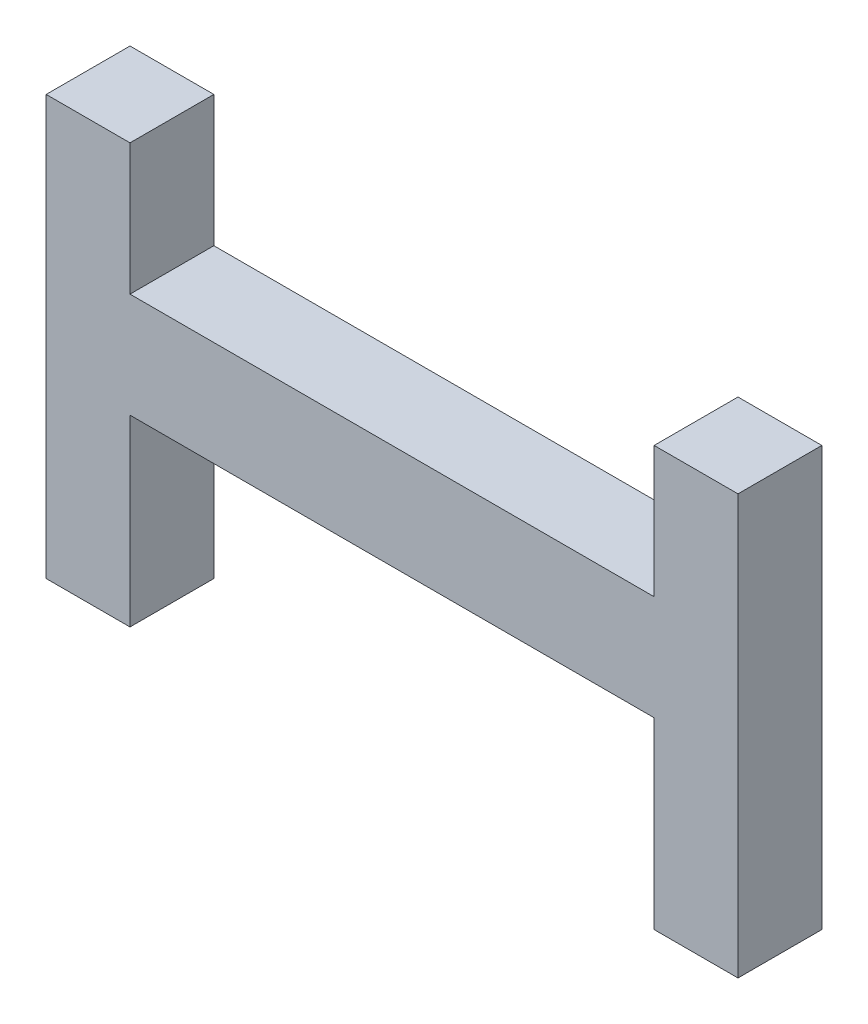
ISO-10303-21;
HEADER;
FILE_DESCRIPTION(('STEP AP214'),'2;1');
FILE_NAME('part.step','',(''),(''),'','','');
FILE_SCHEMA(('AUTOMOTIVE_DESIGN { 1 0 10303 214 1 1 1 1 }'));
ENDSEC;
DATA;
#1=APPLICATION_CONTEXT('core data for automotive mechanical design processes');
#2=APPLICATION_PROTOCOL_DEFINITION('international standard','automotive_design',2000,#1);
#3=PRODUCT_CONTEXT('',#1,'mechanical');
#4=PRODUCT('Part','Part','',(#3));
#5=PRODUCT_RELATED_PRODUCT_CATEGORY('part','',(#4));
#6=PRODUCT_DEFINITION_FORMATION('','',#4);
#7=PRODUCT_DEFINITION_CONTEXT('part definition',#1,'design');
#8=PRODUCT_DEFINITION('design','',#6,#7);
#9=PRODUCT_DEFINITION_SHAPE('','',#8);
#10=(LENGTH_UNIT() NAMED_UNIT(*) SI_UNIT(.MILLI.,.METRE.));
#11=(NAMED_UNIT(*) PLANE_ANGLE_UNIT() SI_UNIT($,.RADIAN.));
#12=(NAMED_UNIT(*) SI_UNIT($,.STERADIAN.) SOLID_ANGLE_UNIT());
#13=UNCERTAINTY_MEASURE_WITH_UNIT(LENGTH_MEASURE(1.E-05),#10,'distance_accuracy_value','');
#14=(GEOMETRIC_REPRESENTATION_CONTEXT(3) GLOBAL_UNCERTAINTY_ASSIGNED_CONTEXT((#13)) GLOBAL_UNIT_ASSIGNED_CONTEXT((#10,
#11,#12)) REPRESENTATION_CONTEXT('',''));
#15=CARTESIAN_POINT('',(0.,0.,0.));
#16=DIRECTION('',(0.,0.,1.));
#17=DIRECTION('',(1.,0.,0.));
#18=AXIS2_PLACEMENT_3D('',#15,#16,#17);
#19=CARTESIAN_POINT('',(7.22497558593748,4.,1.6));
#20=DIRECTION('',(0.,-1.,0.));
#21=DIRECTION('',(0.,0.,-1.));
#22=AXIS2_PLACEMENT_3D('',#19,#20,#21);
#23=PLANE('',#22);
#24=DIRECTION('',(-1.,0.,0.));
#25=VECTOR('',#24,1.);
#26=CARTESIAN_POINT('',(7.22497558593748,4.,0.));
#27=LINE('',#26,#25);
#28=CARTESIAN_POINT('',(8.8250732421875,4.,0.));
#29=VERTEX_POINT('',#28);
#30=CARTESIAN_POINT('',(7.22497558593748,4.,0.));
#31=VERTEX_POINT('',#30);
#32=EDGE_CURVE('E159',#29,#31,#27,.T.);
#33=ORIENTED_EDGE('',*,*,#32,.T.);
#34=DIRECTION('',(0.,0.,-1.));
#35=VECTOR('',#34,1.);
#36=CARTESIAN_POINT('',(7.22497558593748,4.,1.6));
#37=LINE('',#36,#35);
#38=CARTESIAN_POINT('',(7.22497558593748,4.,1.6));
#39=VERTEX_POINT('',#38);
#40=EDGE_CURVE('E11',#39,#31,#37,.T.);
#41=ORIENTED_EDGE('',*,*,#40,.F.);
#42=DIRECTION('',(-1.,0.,0.));
#43=VECTOR('',#42,1.);
#44=CARTESIAN_POINT('',(7.22497558593748,4.,1.6));
#45=LINE('',#44,#43);
#46=CARTESIAN_POINT('',(8.8250732421875,4.,1.6));
#47=VERTEX_POINT('',#46);
#48=EDGE_CURVE('E181',#47,#39,#45,.T.);
#49=ORIENTED_EDGE('',*,*,#48,.F.);
#50=DIRECTION('',(0.,0.,-1.));
#51=VECTOR('',#50,1.);
#52=CARTESIAN_POINT('',(8.8250732421875,4.,1.6));
#53=LINE('',#52,#51);
#54=EDGE_CURVE('E155',#47,#29,#53,.T.);
#55=ORIENTED_EDGE('',*,*,#54,.T.);
#56=EDGE_LOOP('',(#33,#41,#49,#55));
#57=FACE_BOUND('',#56,.T.);
#58=ADVANCED_FACE('F39',(#57),#23,.F.);
#59=CARTESIAN_POINT('',(7.22497558593748,1.5,1.6));
#60=DIRECTION('',(1.,0.,0.));
#61=DIRECTION('',(0.,0.,-1.));
#62=AXIS2_PLACEMENT_3D('',#59,#60,#61);
#63=PLANE('',#62);
#64=DIRECTION('',(0.,-1.,0.));
#65=VECTOR('',#64,1.);
#66=CARTESIAN_POINT('',(7.22497558593748,1.5,0.));
#67=LINE('',#66,#65);
#68=CARTESIAN_POINT('',(7.22497558593748,1.5,0.));
#69=VERTEX_POINT('',#68);
#70=EDGE_CURVE('E162',#31,#69,#67,.T.);
#71=ORIENTED_EDGE('',*,*,#70,.T.);
#72=DIRECTION('',(0.,0.,-1.));
#73=VECTOR('',#72,1.);
#74=CARTESIAN_POINT('',(7.22497558593748,1.5,1.6));
#75=LINE('',#74,#73);
#76=CARTESIAN_POINT('',(7.22497558593748,1.5,1.6));
#77=VERTEX_POINT('',#76);
#78=EDGE_CURVE('E47',#77,#69,#75,.T.);
#79=ORIENTED_EDGE('',*,*,#78,.F.);
#80=DIRECTION('',(0.,-1.,0.));
#81=VECTOR('',#80,1.);
#82=CARTESIAN_POINT('',(7.22497558593748,1.5,1.6));
#83=LINE('',#82,#81);
#84=EDGE_CURVE('E110',#39,#77,#83,.T.);
#85=ORIENTED_EDGE('',*,*,#84,.F.);
#86=ORIENTED_EDGE('',*,*,#40,.T.);
#87=EDGE_LOOP('',(#71,#79,#85,#86));
#88=FACE_BOUND('',#87,.T.);
#89=ADVANCED_FACE('F259',(#88),#63,.F.);
#90=CARTESIAN_POINT('',(-2.77502441406252,1.5,1.6));
#91=DIRECTION('',(0.,-1.,0.));
#92=DIRECTION('',(0.,0.,-1.));
#93=AXIS2_PLACEMENT_3D('',#90,#91,#92);
#94=PLANE('',#93);
#95=DIRECTION('',(-1.,0.,0.));
#96=VECTOR('',#95,1.);
#97=CARTESIAN_POINT('',(-2.77502441406252,1.5,0.));
#98=LINE('',#97,#96);
#99=CARTESIAN_POINT('',(-2.77502441406252,1.5,0.));
#100=VERTEX_POINT('',#99);
#101=EDGE_CURVE('E164',#69,#100,#98,.T.);
#102=ORIENTED_EDGE('',*,*,#101,.T.);
#103=DIRECTION('',(0.,0.,-1.));
#104=VECTOR('',#103,1.);
#105=CARTESIAN_POINT('',(-2.77502441406252,1.5,1.6));
#106=LINE('',#105,#104);
#107=CARTESIAN_POINT('',(-2.77502441406252,1.5,1.6));
#108=VERTEX_POINT('',#107);
#109=EDGE_CURVE('E200',#108,#100,#106,.T.);
#110=ORIENTED_EDGE('',*,*,#109,.F.);
#111=DIRECTION('',(-1.,0.,0.));
#112=VECTOR('',#111,1.);
#113=CARTESIAN_POINT('',(-2.77502441406252,1.5,1.6));
#114=LINE('',#113,#112);
#115=EDGE_CURVE('E208',#77,#108,#114,.T.);
#116=ORIENTED_EDGE('',*,*,#115,.F.);
#117=ORIENTED_EDGE('',*,*,#78,.T.);
#118=EDGE_LOOP('',(#102,#110,#116,#117));
#119=FACE_BOUND('',#118,.T.);
#120=ADVANCED_FACE('F206',(#119),#94,.F.);
#121=CARTESIAN_POINT('',(-2.77502441406252,4.,1.6));
#122=DIRECTION('',(-1.,0.,0.));
#123=DIRECTION('',(0.,0.,1.));
#124=AXIS2_PLACEMENT_3D('',#121,#122,#123);
#125=PLANE('',#124);
#126=DIRECTION('',(0.,1.,0.));
#127=VECTOR('',#126,1.);
#128=CARTESIAN_POINT('',(-2.77502441406252,4.,0.));
#129=LINE('',#128,#127);
#130=CARTESIAN_POINT('',(-2.77502441406252,4.,0.));
#131=VERTEX_POINT('',#130);
#132=EDGE_CURVE('E166',#100,#131,#129,.T.);
#133=ORIENTED_EDGE('',*,*,#132,.T.);
#134=DIRECTION('',(0.,0.,-1.));
#135=VECTOR('',#134,1.);
#136=CARTESIAN_POINT('',(-2.77502441406252,4.,1.6));
#137=LINE('',#136,#135);
#138=CARTESIAN_POINT('',(-2.77502441406252,4.,1.6));
#139=VERTEX_POINT('',#138);
#140=EDGE_CURVE('E197',#139,#131,#137,.T.);
#141=ORIENTED_EDGE('',*,*,#140,.F.);
#142=DIRECTION('',(0.,1.,0.));
#143=VECTOR('',#142,1.);
#144=CARTESIAN_POINT('',(-2.77502441406252,4.,1.6));
#145=LINE('',#144,#143);
#146=EDGE_CURVE('E226',#108,#139,#145,.T.);
#147=ORIENTED_EDGE('',*,*,#146,.F.);
#148=ORIENTED_EDGE('',*,*,#109,.T.);
#149=EDGE_LOOP('',(#133,#141,#147,#148));
#150=FACE_BOUND('',#149,.T.);
#151=ADVANCED_FACE('F217',(#150),#125,.F.);
#152=CARTESIAN_POINT('',(-4.37500000000002,4.,1.6));
#153=DIRECTION('',(0.,-1.,0.));
#154=DIRECTION('',(0.,0.,-1.));
#155=AXIS2_PLACEMENT_3D('',#152,#153,#154);
#156=PLANE('',#155);
#157=DIRECTION('',(-1.,0.,0.));
#158=VECTOR('',#157,1.);
#159=CARTESIAN_POINT('',(-4.37500000000002,4.,0.));
#160=LINE('',#159,#158);
#161=CARTESIAN_POINT('',(-4.37500000000002,4.,0.));
#162=VERTEX_POINT('',#161);
#163=EDGE_CURVE('E168',#131,#162,#160,.T.);
#164=ORIENTED_EDGE('',*,*,#163,.T.);
#165=DIRECTION('',(0.,0.,-1.));
#166=VECTOR('',#165,1.);
#167=CARTESIAN_POINT('',(-4.37500000000002,4.,1.6));
#168=LINE('',#167,#166);
#169=CARTESIAN_POINT('',(-4.37500000000002,4.,1.6));
#170=VERTEX_POINT('',#169);
#171=EDGE_CURVE('E194',#170,#162,#168,.T.);
#172=ORIENTED_EDGE('',*,*,#171,.F.);
#173=DIRECTION('',(-1.,0.,0.));
#174=VECTOR('',#173,1.);
#175=CARTESIAN_POINT('',(-4.37500000000002,4.,1.6));
#176=LINE('',#175,#174);
#177=EDGE_CURVE('E223',#139,#170,#176,.T.);
#178=ORIENTED_EDGE('',*,*,#177,.F.);
#179=ORIENTED_EDGE('',*,*,#140,.T.);
#180=EDGE_LOOP('',(#164,#172,#178,#179));
#181=FACE_BOUND('',#180,.T.);
#182=ADVANCED_FACE('F221',(#181),#156,.F.);
#183=CARTESIAN_POINT('',(-4.37500000000002,-4.,1.6));
#184=DIRECTION('',(1.,0.,0.));
#185=DIRECTION('',(0.,0.,-1.));
#186=AXIS2_PLACEMENT_3D('',#183,#184,#185);
#187=PLANE('',#186);
#188=DIRECTION('',(0.,-1.,0.));
#189=VECTOR('',#188,1.);
#190=CARTESIAN_POINT('',(-4.37500000000002,-4.,0.));
#191=LINE('',#190,#189);
#192=CARTESIAN_POINT('',(-4.37500000000002,-4.,0.));
#193=VERTEX_POINT('',#192);
#194=EDGE_CURVE('E170',#162,#193,#191,.T.);
#195=ORIENTED_EDGE('',*,*,#194,.T.);
#196=DIRECTION('',(0.,0.,-1.));
#197=VECTOR('',#196,1.);
#198=CARTESIAN_POINT('',(-4.37500000000002,-4.,1.6));
#199=LINE('',#198,#197);
#200=CARTESIAN_POINT('',(-4.37500000000002,-4.,1.6));
#201=VERTEX_POINT('',#200);
#202=EDGE_CURVE('E191',#201,#193,#199,.T.);
#203=ORIENTED_EDGE('',*,*,#202,.F.);
#204=DIRECTION('',(0.,-1.,0.));
#205=VECTOR('',#204,1.);
#206=CARTESIAN_POINT('',(-4.37500000000002,-4.,1.6));
#207=LINE('',#206,#205);
#208=EDGE_CURVE('E225',#170,#201,#207,.T.);
#209=ORIENTED_EDGE('',*,*,#208,.F.);
#210=ORIENTED_EDGE('',*,*,#171,.T.);
#211=EDGE_LOOP('',(#195,#203,#209,#210));
#212=FACE_BOUND('',#211,.T.);
#213=ADVANCED_FACE('F272',(#212),#187,.F.);
#214=CARTESIAN_POINT('',(-2.77502441406252,-4.,1.6));
#215=DIRECTION('',(0.,1.,0.));
#216=DIRECTION('',(0.,0.,1.));
#217=AXIS2_PLACEMENT_3D('',#214,#215,#216);
#218=PLANE('',#217);
#219=DIRECTION('',(1.,0.,0.));
#220=VECTOR('',#219,1.);
#221=CARTESIAN_POINT('',(-2.77502441406252,-4.,0.));
#222=LINE('',#221,#220);
#223=CARTESIAN_POINT('',(-2.77502441406252,-4.,0.));
#224=VERTEX_POINT('',#223);
#225=EDGE_CURVE('E172',#193,#224,#222,.T.);
#226=ORIENTED_EDGE('',*,*,#225,.T.);
#227=DIRECTION('',(0.,0.,-1.));
#228=VECTOR('',#227,1.);
#229=CARTESIAN_POINT('',(-2.77502441406252,-4.,1.6));
#230=LINE('',#229,#228);
#231=CARTESIAN_POINT('',(-2.77502441406252,-4.,1.6));
#232=VERTEX_POINT('',#231);
#233=EDGE_CURVE('E188',#232,#224,#230,.T.);
#234=ORIENTED_EDGE('',*,*,#233,.F.);
#235=DIRECTION('',(1.,0.,0.));
#236=VECTOR('',#235,1.);
#237=CARTESIAN_POINT('',(-2.77502441406252,-4.,1.6));
#238=LINE('',#237,#236);
#239=EDGE_CURVE('E228',#201,#232,#238,.T.);
#240=ORIENTED_EDGE('',*,*,#239,.F.);
#241=ORIENTED_EDGE('',*,*,#202,.T.);
#242=EDGE_LOOP('',(#226,#234,#240,#241));
#243=FACE_BOUND('',#242,.T.);
#244=ADVANCED_FACE('F275',(#243),#218,.F.);
#245=CARTESIAN_POINT('',(-2.77502441406252,-0.5,1.6));
#246=DIRECTION('',(-1.,0.,0.));
#247=DIRECTION('',(0.,0.,1.));
#248=AXIS2_PLACEMENT_3D('',#245,#246,#247);
#249=PLANE('',#248);
#250=DIRECTION('',(0.,1.,0.));
#251=VECTOR('',#250,1.);
#252=CARTESIAN_POINT('',(-2.77502441406252,-0.5,0.));
#253=LINE('',#252,#251);
#254=CARTESIAN_POINT('',(-2.77502441406252,-0.5,0.));
#255=VERTEX_POINT('',#254);
#256=EDGE_CURVE('E174',#224,#255,#253,.T.);
#257=ORIENTED_EDGE('',*,*,#256,.T.);
#258=DIRECTION('',(0.,0.,-1.));
#259=VECTOR('',#258,1.);
#260=CARTESIAN_POINT('',(-2.77502441406252,-0.5,1.6));
#261=LINE('',#260,#259);
#262=CARTESIAN_POINT('',(-2.77502441406252,-0.5,1.6));
#263=VERTEX_POINT('',#262);
#264=EDGE_CURVE('E185',#263,#255,#261,.T.);
#265=ORIENTED_EDGE('',*,*,#264,.F.);
#266=DIRECTION('',(0.,1.,0.));
#267=VECTOR('',#266,1.);
#268=CARTESIAN_POINT('',(-2.77502441406252,-0.5,1.6));
#269=LINE('',#268,#267);
#270=EDGE_CURVE('E234',#232,#263,#269,.T.);
#271=ORIENTED_EDGE('',*,*,#270,.F.);
#272=ORIENTED_EDGE('',*,*,#233,.T.);
#273=EDGE_LOOP('',(#257,#265,#271,#272));
#274=FACE_BOUND('',#273,.T.);
#275=ADVANCED_FACE('F240',(#274),#249,.F.);
#276=CARTESIAN_POINT('',(7.22497558593748,-0.499999999999999,1.6));
#277=DIRECTION('',(0.,1.,0.));
#278=DIRECTION('',(-1.,0.,0.));
#279=AXIS2_PLACEMENT_3D('',#276,#277,#278);
#280=PLANE('',#279);
#281=DIRECTION('',(1.,0.,0.));
#282=VECTOR('',#281,1.);
#283=CARTESIAN_POINT('',(7.22497558593748,-0.499999999999999,0.));
#284=LINE('',#283,#282);
#285=CARTESIAN_POINT('',(7.22497558593748,-0.499999999999999,0.));
#286=VERTEX_POINT('',#285);
#287=EDGE_CURVE('E176',#255,#286,#284,.T.);
#288=ORIENTED_EDGE('',*,*,#287,.T.);
#289=DIRECTION('',(0.,0.,-1.));
#290=VECTOR('',#289,1.);
#291=CARTESIAN_POINT('',(7.22497558593748,-0.499999999999999,1.6));
#292=LINE('',#291,#290);
#293=CARTESIAN_POINT('',(7.22497558593748,-0.499999999999999,1.6));
#294=VERTEX_POINT('',#293);
#295=EDGE_CURVE('E150',#294,#286,#292,.T.);
#296=ORIENTED_EDGE('',*,*,#295,.F.);
#297=DIRECTION('',(1.,0.,0.));
#298=VECTOR('',#297,1.);
#299=CARTESIAN_POINT('',(7.22497558593748,-0.499999999999999,1.6));
#300=LINE('',#299,#298);
#301=EDGE_CURVE('E141',#263,#294,#300,.T.);
#302=ORIENTED_EDGE('',*,*,#301,.F.);
#303=ORIENTED_EDGE('',*,*,#264,.T.);
#304=EDGE_LOOP('',(#288,#296,#302,#303));
#305=FACE_BOUND('',#304,.T.);
#306=ADVANCED_FACE('F244',(#305),#280,.F.);
#307=CARTESIAN_POINT('',(7.22497558593748,-4.,1.6));
#308=DIRECTION('',(1.,0.,0.));
#309=DIRECTION('',(0.,0.,-1.));
#310=AXIS2_PLACEMENT_3D('',#307,#308,#309);
#311=PLANE('',#310);
#312=DIRECTION('',(0.,-1.,0.));
#313=VECTOR('',#312,1.);
#314=CARTESIAN_POINT('',(7.22497558593748,-4.,0.));
#315=LINE('',#314,#313);
#316=CARTESIAN_POINT('',(7.22497558593748,-4.,0.));
#317=VERTEX_POINT('',#316);
#318=EDGE_CURVE('E149',#286,#317,#315,.T.);
#319=ORIENTED_EDGE('',*,*,#318,.T.);
#320=DIRECTION('',(0.,0.,-1.));
#321=VECTOR('',#320,1.);
#322=CARTESIAN_POINT('',(7.22497558593748,-4.,1.6));
#323=LINE('',#322,#321);
#324=CARTESIAN_POINT('',(7.22497558593748,-4.,1.6));
#325=VERTEX_POINT('',#324);
#326=EDGE_CURVE('E146',#325,#317,#323,.T.);
#327=ORIENTED_EDGE('',*,*,#326,.F.);
#328=DIRECTION('',(0.,-1.,0.));
#329=VECTOR('',#328,1.);
#330=CARTESIAN_POINT('',(7.22497558593748,-4.,1.6));
#331=LINE('',#330,#329);
#332=EDGE_CURVE('E135',#294,#325,#331,.T.);
#333=ORIENTED_EDGE('',*,*,#332,.F.);
#334=ORIENTED_EDGE('',*,*,#295,.T.);
#335=EDGE_LOOP('',(#319,#327,#333,#334));
#336=FACE_BOUND('',#335,.T.);
#337=ADVANCED_FACE('F147',(#336),#311,.F.);
#338=CARTESIAN_POINT('',(8.8250732421875,-3.99999999999999,1.6));
#339=DIRECTION('',(0.,1.,0.));
#340=DIRECTION('',(-1.,0.,0.));
#341=AXIS2_PLACEMENT_3D('',#338,#339,#340);
#342=PLANE('',#341);
#343=DIRECTION('',(1.,0.,0.));
#344=VECTOR('',#343,1.);
#345=CARTESIAN_POINT('',(8.8250732421875,-3.99999999999999,0.));
#346=LINE('',#345,#344);
#347=CARTESIAN_POINT('',(8.8250732421875,-3.99999999999999,0.));
#348=VERTEX_POINT('',#347);
#349=EDGE_CURVE('E96',#317,#348,#346,.T.);
#350=ORIENTED_EDGE('',*,*,#349,.T.);
#351=DIRECTION('',(0.,0.,-1.));
#352=VECTOR('',#351,1.);
#353=CARTESIAN_POINT('',(8.8250732421875,-3.99999999999999,1.6));
#354=LINE('',#353,#352);
#355=CARTESIAN_POINT('',(8.8250732421875,-3.99999999999999,1.6));
#356=VERTEX_POINT('',#355);
#357=EDGE_CURVE('E151',#356,#348,#354,.T.);
#358=ORIENTED_EDGE('',*,*,#357,.F.);
#359=DIRECTION('',(1.,0.,0.));
#360=VECTOR('',#359,1.);
#361=CARTESIAN_POINT('',(8.8250732421875,-3.99999999999999,1.6));
#362=LINE('',#361,#360);
#363=EDGE_CURVE('E139',#325,#356,#362,.T.);
#364=ORIENTED_EDGE('',*,*,#363,.F.);
#365=ORIENTED_EDGE('',*,*,#326,.T.);
#366=EDGE_LOOP('',(#350,#358,#364,#365));
#367=FACE_BOUND('',#366,.T.);
#368=ADVANCED_FACE('F153',(#367),#342,.F.);
#369=CARTESIAN_POINT('',(8.8250732421875,4.,1.6));
#370=DIRECTION('',(-1.,0.,0.));
#371=DIRECTION('',(0.,0.,1.));
#372=AXIS2_PLACEMENT_3D('',#369,#370,#371);
#373=PLANE('',#372);
#374=DIRECTION('',(0.,1.,0.));
#375=VECTOR('',#374,1.);
#376=CARTESIAN_POINT('',(8.8250732421875,4.,0.));
#377=LINE('',#376,#375);
#378=EDGE_CURVE('E102',#348,#29,#377,.T.);
#379=ORIENTED_EDGE('',*,*,#378,.T.);
#380=ORIENTED_EDGE('',*,*,#54,.F.);
#381=DIRECTION('',(0.,1.,0.));
#382=VECTOR('',#381,1.);
#383=CARTESIAN_POINT('',(8.8250732421875,4.,1.6));
#384=LINE('',#383,#382);
#385=EDGE_CURVE('E55',#356,#47,#384,.T.);
#386=ORIENTED_EDGE('',*,*,#385,.F.);
#387=ORIENTED_EDGE('',*,*,#357,.T.);
#388=EDGE_LOOP('',(#379,#380,#386,#387));
#389=FACE_BOUND('',#388,.T.);
#390=ADVANCED_FACE('F248',(#389),#373,.F.);
#391=CARTESIAN_POINT('',(0.,0.,1.6));
#392=DIRECTION('',(0.,0.,-1.));
#393=DIRECTION('',(-1.,0.,0.));
#394=AXIS2_PLACEMENT_3D('',#391,#392,#393);
#395=PLANE('',#394);
#396=ORIENTED_EDGE('',*,*,#48,.T.);
#397=ORIENTED_EDGE('',*,*,#84,.T.);
#398=ORIENTED_EDGE('',*,*,#115,.T.);
#399=ORIENTED_EDGE('',*,*,#146,.T.);
#400=ORIENTED_EDGE('',*,*,#177,.T.);
#401=ORIENTED_EDGE('',*,*,#208,.T.);
#402=ORIENTED_EDGE('',*,*,#239,.T.);
#403=ORIENTED_EDGE('',*,*,#270,.T.);
#404=ORIENTED_EDGE('',*,*,#301,.T.);
#405=ORIENTED_EDGE('',*,*,#332,.T.);
#406=ORIENTED_EDGE('',*,*,#363,.T.);
#407=ORIENTED_EDGE('',*,*,#385,.T.);
#408=EDGE_LOOP('',(#396,#397,#398,#399,#400,#401,#402,#403,#404,#405,#406,#407));
#409=FACE_BOUND('',#408,.T.);
#410=ADVANCED_FACE('F137',(#409),#395,.F.);
#411=CARTESIAN_POINT('',(0.,0.,0.));
#412=DIRECTION('',(0.,0.,-1.));
#413=DIRECTION('',(-1.,0.,0.));
#414=AXIS2_PLACEMENT_3D('',#411,#412,#413);
#415=PLANE('',#414);
#416=ORIENTED_EDGE('',*,*,#32,.F.);
#417=ORIENTED_EDGE('',*,*,#378,.F.);
#418=ORIENTED_EDGE('',*,*,#349,.F.);
#419=ORIENTED_EDGE('',*,*,#318,.F.);
#420=ORIENTED_EDGE('',*,*,#287,.F.);
#421=ORIENTED_EDGE('',*,*,#256,.F.);
#422=ORIENTED_EDGE('',*,*,#225,.F.);
#423=ORIENTED_EDGE('',*,*,#194,.F.);
#424=ORIENTED_EDGE('',*,*,#163,.F.);
#425=ORIENTED_EDGE('',*,*,#132,.F.);
#426=ORIENTED_EDGE('',*,*,#101,.F.);
#427=ORIENTED_EDGE('',*,*,#70,.F.);
#428=EDGE_LOOP('',(#416,#417,#418,#419,#420,#421,#422,#423,#424,#425,#426,#427));
#429=FACE_BOUND('',#428,.T.);
#430=ADVANCED_FACE('F212',(#429),#415,.T.);
#431=CLOSED_SHELL('',(#58,#89,#120,#151,#182,#213,#244,#275,#306,#337,#368,#390,#410,#430));
#432=MANIFOLD_SOLID_BREP('B2',#431);
#433=ADVANCED_BREP_SHAPE_REPRESENTATION('',(#18,#432),#14);
#434=SHAPE_DEFINITION_REPRESENTATION(#9,#433);
ENDSEC;
END-ISO-10303-21;
